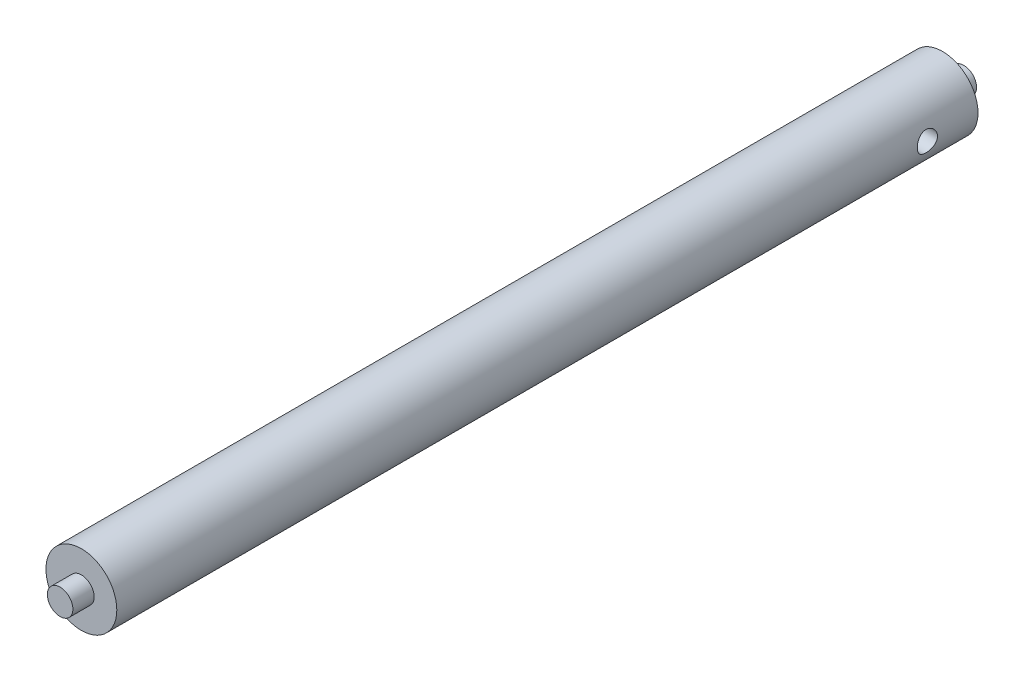
ISO-10303-21;
HEADER;
FILE_DESCRIPTION(('STEP AP214'),'2;1');
FILE_NAME('part.step','',(''),(''),'','','');
FILE_SCHEMA(('AUTOMOTIVE_DESIGN { 1 0 10303 214 1 1 1 1 }'));
ENDSEC;
DATA;
#1=APPLICATION_CONTEXT('core data for automotive mechanical design processes');
#2=APPLICATION_PROTOCOL_DEFINITION('international standard','automotive_design',2000,#1);
#3=PRODUCT_CONTEXT('',#1,'mechanical');
#4=PRODUCT('Part','Part','',(#3));
#5=PRODUCT_RELATED_PRODUCT_CATEGORY('part','',(#4));
#6=PRODUCT_DEFINITION_FORMATION('','',#4);
#7=PRODUCT_DEFINITION_CONTEXT('part definition',#1,'design');
#8=PRODUCT_DEFINITION('design','',#6,#7);
#9=PRODUCT_DEFINITION_SHAPE('','',#8);
#10=(LENGTH_UNIT() NAMED_UNIT(*) SI_UNIT(.MILLI.,.METRE.));
#11=(NAMED_UNIT(*) PLANE_ANGLE_UNIT() SI_UNIT($,.RADIAN.));
#12=(NAMED_UNIT(*) SI_UNIT($,.STERADIAN.) SOLID_ANGLE_UNIT());
#13=UNCERTAINTY_MEASURE_WITH_UNIT(LENGTH_MEASURE(1.E-05),#10,'distance_accuracy_value','');
#14=(GEOMETRIC_REPRESENTATION_CONTEXT(3) GLOBAL_UNCERTAINTY_ASSIGNED_CONTEXT((#13)) GLOBAL_UNIT_ASSIGNED_CONTEXT((#10,
#11,#12)) REPRESENTATION_CONTEXT('',''));
#15=CARTESIAN_POINT('',(0.,0.,0.));
#16=DIRECTION('',(0.,0.,1.));
#17=DIRECTION('',(1.,0.,0.));
#18=AXIS2_PLACEMENT_3D('',#15,#16,#17);
#19=CARTESIAN_POINT('',(0.,0.,1215.));
#20=DIRECTION('',(0.,0.,-1.));
#21=DIRECTION('',(-1.,0.,0.));
#22=AXIS2_PLACEMENT_3D('',#19,#20,#21);
#23=CYLINDRICAL_SURFACE('',#22,50.);
#24=CARTESIAN_POINT('',(-50.,0.,57.1));
#25=CARTESIAN_POINT('',(-49.9999993401578,0.393092581133375,57.1000010634842));
#26=CARTESIAN_POINT('',(-49.9953531545744,0.786204607705896,57.1162220404885));
#27=CARTESIAN_POINT('',(-49.9768949555591,1.5695559511447,57.1809642003));
#28=CARTESIAN_POINT('',(-49.9630823349836,1.95979507599162,57.2294875226702));
#29=CARTESIAN_POINT('',(-49.9266662796267,2.73468272530239,57.3584250289965));
#30=CARTESIAN_POINT('',(-49.9040599422796,3.11932936030579,57.4388497429035));
#31=CARTESIAN_POINT('',(-49.8506749103668,3.88016165533408,57.6308937577085));
#32=CARTESIAN_POINT('',(-49.8198963201253,4.25634742330108,57.7425126603929));
#33=CARTESIAN_POINT('',(-49.7510472300163,4.9971492546484,57.9958392093104));
#34=CARTESIAN_POINT('',(-49.7129871603524,5.36178100786337,58.1375038482982));
#35=CARTESIAN_POINT('',(-49.6305583768323,6.0776228272092,58.4499029969189));
#36=CARTESIAN_POINT('',(-49.5861896500416,6.42883286581989,58.6206375661534));
#37=CARTESIAN_POINT('',(-49.4923050586895,7.11560829245566,58.9899179438816));
#38=CARTESIAN_POINT('',(-49.4427889440032,7.45117291908063,59.1884651040247));
#39=CARTESIAN_POINT('',(-49.3398944080029,8.10458067199358,59.6119821873323));
#40=CARTESIAN_POINT('',(-49.2865157910131,8.42242289901199,59.836953449512));
#41=CARTESIAN_POINT('',(-49.1759791523237,9.04575230571379,60.3174522819858));
#42=CARTESIAN_POINT('',(-49.1187615482356,9.35076830145081,60.5735775569652));
#43=CARTESIAN_POINT('',(-49.0032674110261,9.93828125831789,61.1102540623608));
#44=CARTESIAN_POINT('',(-48.944990862325,10.2207778878036,61.3908056523778));
#45=CARTESIAN_POINT('',(-48.8289527415826,10.7614992098627,61.9745848120467));
#46=CARTESIAN_POINT('',(-48.7711912534701,11.0197200098433,62.2778160043892));
#47=CARTESIAN_POINT('',(-48.6577845038267,11.510142015897,62.9049958799905));
#48=CARTESIAN_POINT('',(-48.6021391869341,11.7423439029671,63.2289440206727));
#49=CARTESIAN_POINT('',(-48.4934364270989,12.1835671085879,63.902270234353));
#50=CARTESIAN_POINT('',(-48.4404540102544,12.3920251254503,64.2520299243441));
#51=CARTESIAN_POINT('',(-48.3399023299518,12.7786448431084,64.9686706337171));
#52=CARTESIAN_POINT('',(-48.2923331584724,12.9568060291437,65.3355519438702));
#53=CARTESIAN_POINT('',(-48.2040825925854,13.281367443723,66.0838394250183));
#54=CARTESIAN_POINT('',(-48.1634000412188,13.4277730084085,66.4652431430195));
#55=CARTESIAN_POINT('',(-48.0902058121124,13.6875982823821,67.2398879869233));
#56=CARTESIAN_POINT('',(-48.057693872318,13.8010190496043,67.6331287327258));
#57=CARTESIAN_POINT('',(-48.0026165468568,13.9913678303361,68.4182905489505));
#58=CARTESIAN_POINT('',(-47.97981719124,14.0691581174541,68.8099862202819));
#59=CARTESIAN_POINT('',(-47.9437018790497,14.1917422429174,69.5989420629842));
#60=CARTESIAN_POINT('',(-47.9303857741428,14.2365365973725,69.9962021472197));
#61=CARTESIAN_POINT('',(-47.9136670362015,14.2927035061851,70.7932110930223));
#62=CARTESIAN_POINT('',(-47.9102625268235,14.3040823863602,71.1929594691748));
#63=CARTESIAN_POINT('',(-47.9134723378561,14.2933272270579,71.9919605259831));
#64=CARTESIAN_POINT('',(-47.9200864662145,14.2711938299941,72.391213215994));
#65=CARTESIAN_POINT('',(-47.9427426868225,14.1948910789509,73.1732356971341));
#66=CARTESIAN_POINT('',(-47.9584710513845,14.1417874016875,73.5561191518278));
#67=CARTESIAN_POINT('',(-47.9986297004423,14.0048787474216,74.3158809162688));
#68=CARTESIAN_POINT('',(-48.0230597682177,13.92107453503,74.6927593753293));
#69=CARTESIAN_POINT('',(-48.079903489307,13.7234629565056,75.4379668424782));
#70=CARTESIAN_POINT('',(-48.1123176380032,13.6096537286431,75.8062953185199));
#71=CARTESIAN_POINT('',(-48.1841948692944,13.3529440492941,76.5319603430521));
#72=CARTESIAN_POINT('',(-48.2236580940452,13.2100430111174,76.8892966696983));
#73=CARTESIAN_POINT('',(-48.309063197558,12.8942425349468,77.5951502495554));
#74=CARTESIAN_POINT('',(-48.3550807358075,12.7209863906123,77.9434986960212));
#75=CARTESIAN_POINT('',(-48.4519208591473,12.3470099831757,78.6244190043368));
#76=CARTESIAN_POINT('',(-48.502743465043,12.146289601155,78.9569907978662));
#77=CARTESIAN_POINT('',(-48.6078196356526,11.7187168810827,79.6044008161063));
#78=CARTESIAN_POINT('',(-48.6620738340249,11.491859710369,79.9192357452159));
#79=CARTESIAN_POINT('',(-48.7725625617209,11.0135092144573,80.5292307478801));
#80=CARTESIAN_POINT('',(-48.8287971417993,10.7620152575553,80.8243903166186));
#81=CARTESIAN_POINT('',(-48.9439156435372,10.2259988522087,81.4040290097903));
#82=CARTESIAN_POINT('',(-49.002819359319,9.94058726465421,81.6876826617283));
#83=CARTESIAN_POINT('',(-49.1195449950259,9.34675608566722,82.23004416876));
#84=CARTESIAN_POINT('',(-49.1773668873108,9.03833590737765,82.4887513871838));
#85=CARTESIAN_POINT('',(-49.2903368902631,8.40045168905322,82.9794794032379));
#86=CARTESIAN_POINT('',(-49.3454848355772,8.07098635052609,83.2114985517281));
#87=CARTESIAN_POINT('',(-49.4515798483811,7.39316606189153,83.6471795118227));
#88=CARTESIAN_POINT('',(-49.5025269449684,7.04481124265135,83.8508415198518));
#89=CARTESIAN_POINT('',(-49.5990768394605,6.32949738342989,84.2293458588072));
#90=CARTESIAN_POINT('',(-49.6446477713202,5.96244423997879,84.4040186237585));
#91=CARTESIAN_POINT('',(-49.7288131089911,5.21410588380415,84.7217240501055));
#92=CARTESIAN_POINT('',(-49.7674074577606,4.83282055474675,84.8647564528067));
#93=CARTESIAN_POINT('',(-49.8364993996225,4.05884627033837,85.1179266577412));
#94=CARTESIAN_POINT('',(-49.8669986542504,3.66615967350749,85.2280712108579));
#95=CARTESIAN_POINT('',(-49.9190184317702,2.87224946868592,85.4145077984625));
#96=CARTESIAN_POINT('',(-49.9405392502037,2.47102614215424,85.4908009472363));
#97=CARTESIAN_POINT('',(-49.9734178080217,1.67642615652176,85.6068812725797));
#98=CARTESIAN_POINT('',(-49.9850864994534,1.28322537807025,85.6477864871573));
#99=CARTESIAN_POINT('',(-49.9991085025536,0.494624390994488,85.6969021641322));
#100=CARTESIAN_POINT('',(-50.0014620185413,0.0992242308020305,85.7051133436413));
#101=CARTESIAN_POINT('',(-49.9967881741196,-0.690797055907189,85.688767847859));
#102=CARTESIAN_POINT('',(-49.9897618391173,-1.08541826285647,85.6642147543643));
#103=CARTESIAN_POINT('',(-49.9665264525646,-1.87100372161427,85.5825701087757));
#104=CARTESIAN_POINT('',(-49.9503174564578,-2.26196799548833,85.5254787531431));
#105=CARTESIAN_POINT('',(-49.9095849111707,-3.02953083340737,85.380750156116));
#106=CARTESIAN_POINT('',(-49.8852363269616,-3.40625999169398,85.2937546915594));
#107=CARTESIAN_POINT('',(-49.828801864031,-4.15089474042818,85.0897442227331));
#108=CARTESIAN_POINT('',(-49.7967161200073,-4.5188004843619,84.9727297410688));
#109=CARTESIAN_POINT('',(-49.72564117397,-5.24339182754383,84.7095990507461));
#110=CARTESIAN_POINT('',(-49.6866514050453,-5.60007650256058,84.5634804521352));
#111=CARTESIAN_POINT('',(-49.6027735541738,-6.29992733226506,84.2432476913964));
#112=CARTESIAN_POINT('',(-49.5578853380162,-6.64309317911984,84.0691328922341));
#113=CARTESIAN_POINT('',(-49.4623270232209,-7.32106086380704,83.6900832635653));
#114=CARTESIAN_POINT('',(-49.4115527190121,-7.65552036007453,83.4845623798493));
#115=CARTESIAN_POINT('',(-49.3063726275638,-8.30603392730534,83.0470364860348));
#116=CARTESIAN_POINT('',(-49.2519667986627,-8.62208778703739,82.8150311720798));
#117=CARTESIAN_POINT('',(-49.1409346391645,-9.23391811313052,82.3260308729654));
#118=CARTESIAN_POINT('',(-49.0843078687388,-9.52969053081517,82.0690309228788));
#119=CARTESIAN_POINT('',(-48.9703249285781,-10.0990890286727,81.5317145686961));
#120=CARTESIAN_POINT('',(-48.9129687466395,-10.3727147377477,81.2513977740545));
#121=CARTESIAN_POINT('',(-48.7971671462314,-10.9047245357105,80.6596132521233));
#122=CARTESIAN_POINT('',(-48.7387477648886,-11.1623136019392,80.3474250735908));
#123=CARTESIAN_POINT('',(-48.6244078232416,-11.6503130316623,79.7020406014983));
#124=CARTESIAN_POINT('',(-48.5684873230805,-11.8807227412231,79.368843802768));
#125=CARTESIAN_POINT('',(-48.4607745832691,-12.3127130239045,78.6836204532021));
#126=CARTESIAN_POINT('',(-48.4089823035997,-12.5142938765079,78.3315940849562));
#127=CARTESIAN_POINT('',(-48.311074096453,-12.8870976202685,77.6110582359327));
#128=CARTESIAN_POINT('',(-48.2649580768278,-13.0583210042661,77.2425490228688));
#129=CARTESIAN_POINT('',(-48.1800473595999,-13.3681983821559,76.4935873090732));
#130=CARTESIAN_POINT('',(-48.1412149157389,-13.5070212584094,76.1132090133734));
#131=CARTESIAN_POINT('',(-48.0717854596705,-13.7520792177055,75.3413528607539));
#132=CARTESIAN_POINT('',(-48.0411884463039,-13.8583143053348,74.9498750053963));
#133=CARTESIAN_POINT('',(-47.9892214294507,-14.0372118429049,74.1588190690431));
#134=CARTESIAN_POINT('',(-47.9678490768455,-14.1098828404858,73.7592430774577));
#135=CARTESIAN_POINT('',(-47.935023615908,-14.2210015313549,72.9549606359918));
#136=CARTESIAN_POINT('',(-47.9235701734816,-14.2594503773332,72.5502543593784));
#137=CARTESIAN_POINT('',(-47.9112006917788,-14.3009539461153,71.7542523257614));
#138=CARTESIAN_POINT('',(-47.9099021215571,-14.3052935853248,71.3630289477578));
#139=CARTESIAN_POINT('',(-47.9168770224861,-14.2819133241611,70.5816342094238));
#140=CARTESIAN_POINT('',(-47.9251502394045,-14.2541942752857,70.1914628214277));
#141=CARTESIAN_POINT('',(-47.9510121577493,-14.1669507402721,69.4150256310124));
#142=CARTESIAN_POINT('',(-47.9686004916324,-14.1074275090193,69.0287596751105));
#143=CARTESIAN_POINT('',(-48.0125543998547,-13.9571035881562,68.262874478678));
#144=CARTESIAN_POINT('',(-48.0389200174383,-13.8663027444458,67.8832552709045));
#145=CARTESIAN_POINT('',(-48.0993237274639,-13.6552904386989,67.1371608999426));
#146=CARTESIAN_POINT('',(-48.1332800995804,-13.5353911457973,66.7705906938961));
#147=CARTESIAN_POINT('',(-48.2080385721042,-13.2666669207845,66.0489442169649));
#148=CARTESIAN_POINT('',(-48.2488405966603,-13.1178423091682,65.6938678187788));
#149=CARTESIAN_POINT('',(-48.3361556341312,-12.7923584444724,64.9973957934226));
#150=CARTESIAN_POINT('',(-48.3826693425431,-12.6156958008837,64.6560018390553));
#151=CARTESIAN_POINT('',(-48.4801413873244,-12.2357809666352,63.9889954242829));
#152=CARTESIAN_POINT('',(-48.5310999736902,-12.0325272800755,63.6633838531416));
#153=CARTESIAN_POINT('',(-48.6378682060473,-11.5935531591283,63.0192811610425));
#154=CARTESIAN_POINT('',(-48.693783087133,-11.3569743314224,62.7013922429979));
#155=CARTESIAN_POINT('',(-48.8073732087695,-10.8584374577466,62.0865151790139));
#156=CARTESIAN_POINT('',(-48.8650484865102,-10.5964788753526,61.7895274750697));
#157=CARTESIAN_POINT('',(-48.9806086089899,-10.0487963116378,61.2182363586558));
#158=CARTESIAN_POINT('',(-49.0384935023844,-9.76306642252164,60.9439386192218));
#159=CARTESIAN_POINT('',(-49.1529037826485,-9.16969616572754,60.4198653381739));
#160=CARTESIAN_POINT('',(-49.2094291938921,-8.86205619126841,60.170089356661));
#161=CARTESIAN_POINT('',(-49.3210333280281,-8.2185767845156,59.6905976431241));
#162=CARTESIAN_POINT('',(-49.3760371985178,-7.88221485997783,59.4615649883469));
#163=CARTESIAN_POINT('',(-49.4814793170541,-7.19065574824217,59.0327037610246));
#164=CARTESIAN_POINT('',(-49.5319173732886,-6.83545777072511,58.8328764151931));
#165=CARTESIAN_POINT('',(-49.6267708335611,-6.10882873481934,58.4640757885479));
#166=CARTESIAN_POINT('',(-49.6711890908296,-5.7374054779654,58.2950878773766));
#167=CARTESIAN_POINT('',(-49.7527517142921,-4.98080308482146,57.9892562715333));
#168=CARTESIAN_POINT('',(-49.7898969033813,-4.59562551057093,57.8524089400361));
#169=CARTESIAN_POINT('',(-49.8515013278377,-3.86572166480394,57.6278458000142));
#170=CARTESIAN_POINT('',(-49.8769863621289,-3.5223349638116,57.536035955306));
#171=CARTESIAN_POINT('',(-49.9210956890984,-2.8292647482291,57.3781758883436));
#172=CARTESIAN_POINT('',(-49.9397204206557,-2.47958163794534,57.3121240182403));
#173=CARTESIAN_POINT('',(-49.969688580105,-1.77600212019871,57.2062563874028));
#174=CARTESIAN_POINT('',(-49.9810329604402,-1.42210627003489,57.1664371947928));
#175=CARTESIAN_POINT('',(-49.9961892876812,-0.712145719146019,57.1133073987561));
#176=CARTESIAN_POINT('',(-50.0000005977146,-0.356080837595765,57.0999990366484));
#177=CARTESIAN_POINT('',(-50.,0.,57.1));
#178=B_SPLINE_CURVE_WITH_KNOTS('',3,(#24,#25,#26,#27,#28,#29,#30,#31,#32,#33,#34,#35,#36,#37,
#38,#39,#40,#41,#42,#43,#44,#45,#46,#47,#48,#49,#50,#51,#52,#53,#54,#55,#56,#57,#58,#59,#60,#61,
#62,#63,#64,#65,#66,#67,#68,#69,#70,#71,#72,#73,#74,#75,#76,#77,#78,#79,#80,#81,#82,#83,#84,#85,
#86,#87,#88,#89,#90,#91,#92,#93,#94,#95,#96,#97,#98,#99,#100,#101,#102,#103,#104,#105,#106,#107,
#108,#109,#110,#111,#112,#113,#114,#115,#116,#117,#118,#119,#120,#121,#122,#123,#124,#125,#126,
#127,#128,#129,#130,#131,#132,#133,#134,#135,#136,#137,#138,#139,#140,#141,#142,#143,#144,#145,
#146,#147,#148,#149,#150,#151,#152,#153,#154,#155,#156,#157,#158,#159,#160,#161,#162,#163,#164,
#165,#166,#167,#168,#169,#170,#171,#172,#173,#174,#175,#176,#177),.UNSPECIFIED.,.T.,.F.,(4,2,2,
2,2,2,2,2,2,2,2,2,2,2,2,2,2,2,2,2,2,2,2,2,2,2,2,2,2,2,2,2,2,2,2,2,2,2,2,2,2,2,2,2,2,2,2,2,2,2,2,
2,2,2,2,2,2,2,2,2,2,2,2,2,2,2,2,2,2,2,2,2,2,2,2,2,4),(0.,1.17895085298414,2.35797980217334,
3.5373982472838,4.71680163705793,5.89452809561153,7.07225696887079,8.2500430978222,
9.42788893568406,10.6336428692281,11.8394145567195,13.0453792592875,14.2513123905811,
15.4816167234651,16.7119419578329,17.9420602907395,19.1721391652332,20.3706321642395,
21.5691064164766,22.7673537732842,23.9655781605857,25.1248198180289,26.2840326059892,
27.4433173368873,28.6026254492243,29.7766029381959,30.9505855105847,32.1247855004183,
33.2990156054267,34.5176321743366,35.7362798359121,36.9550027611547,38.1737172441032,
39.3993266034378,40.6249459830965,41.8503136068423,43.0756408921959,44.2606715660697,
45.4456762473033,46.6305513942046,47.8154193870798,48.9763005959232,50.137161596195,
51.2981179626102,52.4591007495329,53.6452393661725,54.8313915927854,56.0177799194487,
57.2041881215308,58.429536245212,59.6549138446885,60.8802795638751,62.1056253879562,
63.3244340692529,64.5432425790063,65.7617405280139,66.9801974333179,68.1525233090973,
69.3248180479206,70.4970665353776,71.6693207984088,72.8295155817434,73.9896975107588,
75.1500208525047,76.3104094972369,77.509600946332,78.708817746959,79.90833347998,
81.1078276907951,82.3382419781532,83.5687079318864,84.7985886212592,86.0283300779721,
87.0963942899641,88.1643901620472,89.2322462863879,90.3001926872191),.UNSPECIFIED.);
#179=CARTESIAN_POINT('',(-50.,0.,57.1));
#180=VERTEX_POINT('',#179);
#181=EDGE_CURVE('E10',#180,#180,#178,.T.);
#182=ORIENTED_EDGE('',*,*,#181,.T.);
#183=EDGE_LOOP('',(#182));
#184=FACE_BOUND('',#183,.T.);
#185=CARTESIAN_POINT('',(50.,0.,57.1));
#186=CARTESIAN_POINT('',(49.9999993401578,-0.393092581133375,57.1000010634842));
#187=CARTESIAN_POINT('',(49.9953531545744,-0.786204607705896,57.1162220404885));
#188=CARTESIAN_POINT('',(49.9768949555591,-1.5695559511447,57.1809642003));
#189=CARTESIAN_POINT('',(49.9630823349836,-1.95979507599162,57.2294875226702));
#190=CARTESIAN_POINT('',(49.9266662796267,-2.73468272530239,57.3584250289965));
#191=CARTESIAN_POINT('',(49.9040599422796,-3.11932936030579,57.4388497429035));
#192=CARTESIAN_POINT('',(49.8506749103668,-3.88016165533408,57.6308937577085));
#193=CARTESIAN_POINT('',(49.8198963201253,-4.25634742330108,57.7425126603929));
#194=CARTESIAN_POINT('',(49.7510472300163,-4.9971492546484,57.9958392093104));
#195=CARTESIAN_POINT('',(49.7129871603524,-5.36178100786337,58.1375038482982));
#196=CARTESIAN_POINT('',(49.6305583768323,-6.0776228272092,58.4499029969189));
#197=CARTESIAN_POINT('',(49.5861896500416,-6.42883286581989,58.6206375661534));
#198=CARTESIAN_POINT('',(49.4923050586895,-7.11560829245566,58.9899179438816));
#199=CARTESIAN_POINT('',(49.4427889440032,-7.45117291908063,59.1884651040247));
#200=CARTESIAN_POINT('',(49.3398944080029,-8.10458067199358,59.6119821873323));
#201=CARTESIAN_POINT('',(49.2865157910131,-8.42242289901199,59.836953449512));
#202=CARTESIAN_POINT('',(49.1759791523237,-9.04575230571379,60.3174522819858));
#203=CARTESIAN_POINT('',(49.1187615482356,-9.35076830145081,60.5735775569652));
#204=CARTESIAN_POINT('',(49.0032674110261,-9.93828125831789,61.1102540623608));
#205=CARTESIAN_POINT('',(48.944990862325,-10.2207778878036,61.3908056523778));
#206=CARTESIAN_POINT('',(48.8289527415826,-10.7614992098627,61.9745848120467));
#207=CARTESIAN_POINT('',(48.7711912534701,-11.0197200098433,62.2778160043892));
#208=CARTESIAN_POINT('',(48.6577845038267,-11.510142015897,62.9049958799905));
#209=CARTESIAN_POINT('',(48.6021391869341,-11.7423439029671,63.2289440206727));
#210=CARTESIAN_POINT('',(48.4934364270989,-12.1835671085879,63.902270234353));
#211=CARTESIAN_POINT('',(48.4404540102544,-12.3920251254503,64.2520299243441));
#212=CARTESIAN_POINT('',(48.3399023299518,-12.7786448431084,64.9686706337171));
#213=CARTESIAN_POINT('',(48.2923331584724,-12.9568060291437,65.3355519438702));
#214=CARTESIAN_POINT('',(48.2040825925854,-13.281367443723,66.0838394250183));
#215=CARTESIAN_POINT('',(48.1634000412188,-13.4277730084085,66.4652431430195));
#216=CARTESIAN_POINT('',(48.0902058121124,-13.6875982823821,67.2398879869233));
#217=CARTESIAN_POINT('',(48.057693872318,-13.8010190496043,67.6331287327258));
#218=CARTESIAN_POINT('',(48.0026165468568,-13.9913678303361,68.4182905489505));
#219=CARTESIAN_POINT('',(47.97981719124,-14.0691581174541,68.8099862202819));
#220=CARTESIAN_POINT('',(47.9437018790497,-14.1917422429174,69.5989420629842));
#221=CARTESIAN_POINT('',(47.9303857741428,-14.2365365973725,69.9962021472197));
#222=CARTESIAN_POINT('',(47.9136670362015,-14.2927035061851,70.7932110930223));
#223=CARTESIAN_POINT('',(47.9102625268235,-14.3040823863602,71.1929594691748));
#224=CARTESIAN_POINT('',(47.9134723378561,-14.2933272270579,71.9919605259831));
#225=CARTESIAN_POINT('',(47.9200864662145,-14.2711938299941,72.391213215994));
#226=CARTESIAN_POINT('',(47.9427426868225,-14.1948910789509,73.1732356971341));
#227=CARTESIAN_POINT('',(47.9584710513845,-14.1417874016875,73.5561191518278));
#228=CARTESIAN_POINT('',(47.9986297004423,-14.0048787474216,74.3158809162688));
#229=CARTESIAN_POINT('',(48.0230597682177,-13.92107453503,74.6927593753293));
#230=CARTESIAN_POINT('',(48.079903489307,-13.7234629565056,75.4379668424782));
#231=CARTESIAN_POINT('',(48.1123176380032,-13.6096537286431,75.8062953185199));
#232=CARTESIAN_POINT('',(48.1841948692944,-13.3529440492941,76.5319603430521));
#233=CARTESIAN_POINT('',(48.2236580940452,-13.2100430111174,76.8892966696983));
#234=CARTESIAN_POINT('',(48.309063197558,-12.8942425349468,77.5951502495554));
#235=CARTESIAN_POINT('',(48.3550807358075,-12.7209863906123,77.9434986960212));
#236=CARTESIAN_POINT('',(48.4519208591473,-12.3470099831757,78.6244190043368));
#237=CARTESIAN_POINT('',(48.502743465043,-12.146289601155,78.9569907978662));
#238=CARTESIAN_POINT('',(48.6078196356526,-11.7187168810827,79.6044008161063));
#239=CARTESIAN_POINT('',(48.6620738340249,-11.491859710369,79.9192357452159));
#240=CARTESIAN_POINT('',(48.7725625617209,-11.0135092144573,80.5292307478801));
#241=CARTESIAN_POINT('',(48.8287971417993,-10.7620152575553,80.8243903166186));
#242=CARTESIAN_POINT('',(48.9439156435372,-10.2259988522087,81.4040290097903));
#243=CARTESIAN_POINT('',(49.002819359319,-9.94058726465421,81.6876826617283));
#244=CARTESIAN_POINT('',(49.1195449950259,-9.34675608566722,82.23004416876));
#245=CARTESIAN_POINT('',(49.1773668873108,-9.03833590737765,82.4887513871838));
#246=CARTESIAN_POINT('',(49.2903368902631,-8.40045168905322,82.9794794032379));
#247=CARTESIAN_POINT('',(49.3454848355772,-8.07098635052609,83.2114985517281));
#248=CARTESIAN_POINT('',(49.4515798483811,-7.39316606189153,83.6471795118227));
#249=CARTESIAN_POINT('',(49.5025269449684,-7.04481124265135,83.8508415198518));
#250=CARTESIAN_POINT('',(49.5990768394605,-6.32949738342989,84.2293458588072));
#251=CARTESIAN_POINT('',(49.6446477713202,-5.96244423997879,84.4040186237585));
#252=CARTESIAN_POINT('',(49.7288131089911,-5.21410588380415,84.7217240501055));
#253=CARTESIAN_POINT('',(49.7674074577606,-4.83282055474675,84.8647564528067));
#254=CARTESIAN_POINT('',(49.8364993996225,-4.05884627033837,85.1179266577412));
#255=CARTESIAN_POINT('',(49.8669986542504,-3.66615967350749,85.2280712108579));
#256=CARTESIAN_POINT('',(49.9190184317702,-2.87224946868592,85.4145077984625));
#257=CARTESIAN_POINT('',(49.9405392502037,-2.47102614215424,85.4908009472363));
#258=CARTESIAN_POINT('',(49.9734178080217,-1.67642615652176,85.6068812725797));
#259=CARTESIAN_POINT('',(49.9850864994534,-1.28322537807025,85.6477864871573));
#260=CARTESIAN_POINT('',(49.9991085025536,-0.494624390994488,85.6969021641322));
#261=CARTESIAN_POINT('',(50.0014620185413,-0.0992242308020305,85.7051133436413));
#262=CARTESIAN_POINT('',(49.9967881741196,0.690797055907189,85.688767847859));
#263=CARTESIAN_POINT('',(49.9897618391173,1.08541826285647,85.6642147543643));
#264=CARTESIAN_POINT('',(49.9665264525646,1.87100372161427,85.5825701087757));
#265=CARTESIAN_POINT('',(49.9503174564578,2.26196799548833,85.5254787531431));
#266=CARTESIAN_POINT('',(49.9095849111707,3.02953083340737,85.380750156116));
#267=CARTESIAN_POINT('',(49.8852363269616,3.40625999169398,85.2937546915594));
#268=CARTESIAN_POINT('',(49.828801864031,4.15089474042818,85.0897442227331));
#269=CARTESIAN_POINT('',(49.7967161200073,4.5188004843619,84.9727297410688));
#270=CARTESIAN_POINT('',(49.72564117397,5.24339182754383,84.7095990507461));
#271=CARTESIAN_POINT('',(49.6866514050453,5.60007650256058,84.5634804521352));
#272=CARTESIAN_POINT('',(49.6027735541738,6.29992733226506,84.2432476913964));
#273=CARTESIAN_POINT('',(49.5578853380162,6.64309317911984,84.0691328922341));
#274=CARTESIAN_POINT('',(49.4623270232209,7.32106086380704,83.6900832635653));
#275=CARTESIAN_POINT('',(49.4115527190121,7.65552036007453,83.4845623798493));
#276=CARTESIAN_POINT('',(49.3063726275638,8.30603392730534,83.0470364860348));
#277=CARTESIAN_POINT('',(49.2519667986627,8.62208778703739,82.8150311720798));
#278=CARTESIAN_POINT('',(49.1409346391645,9.23391811313052,82.3260308729654));
#279=CARTESIAN_POINT('',(49.0843078687388,9.52969053081517,82.0690309228788));
#280=CARTESIAN_POINT('',(48.9703249285781,10.0990890286727,81.5317145686961));
#281=CARTESIAN_POINT('',(48.9129687466395,10.3727147377477,81.2513977740545));
#282=CARTESIAN_POINT('',(48.7971671462314,10.9047245357105,80.6596132521233));
#283=CARTESIAN_POINT('',(48.7387477648886,11.1623136019392,80.3474250735908));
#284=CARTESIAN_POINT('',(48.6244078232416,11.6503130316623,79.7020406014983));
#285=CARTESIAN_POINT('',(48.5684873230805,11.8807227412231,79.368843802768));
#286=CARTESIAN_POINT('',(48.4607745832691,12.3127130239045,78.6836204532021));
#287=CARTESIAN_POINT('',(48.4089823035997,12.5142938765079,78.3315940849562));
#288=CARTESIAN_POINT('',(48.311074096453,12.8870976202685,77.6110582359327));
#289=CARTESIAN_POINT('',(48.2649580768278,13.0583210042661,77.2425490228688));
#290=CARTESIAN_POINT('',(48.1800473595999,13.3681983821559,76.4935873090732));
#291=CARTESIAN_POINT('',(48.1412149157389,13.5070212584094,76.1132090133734));
#292=CARTESIAN_POINT('',(48.0717854596705,13.7520792177055,75.3413528607539));
#293=CARTESIAN_POINT('',(48.0411884463039,13.8583143053348,74.9498750053963));
#294=CARTESIAN_POINT('',(47.9892214294507,14.0372118429049,74.1588190690431));
#295=CARTESIAN_POINT('',(47.9678490768455,14.1098828404858,73.7592430774577));
#296=CARTESIAN_POINT('',(47.935023615908,14.2210015313549,72.9549606359918));
#297=CARTESIAN_POINT('',(47.9235701734816,14.2594503773332,72.5502543593784));
#298=CARTESIAN_POINT('',(47.9112006917788,14.3009539461153,71.7542523257614));
#299=CARTESIAN_POINT('',(47.9099021215571,14.3052935853248,71.3630289477578));
#300=CARTESIAN_POINT('',(47.9168770224861,14.2819133241611,70.5816342094238));
#301=CARTESIAN_POINT('',(47.9251502394045,14.2541942752857,70.1914628214277));
#302=CARTESIAN_POINT('',(47.9510121577493,14.1669507402721,69.4150256310124));
#303=CARTESIAN_POINT('',(47.9686004916324,14.1074275090193,69.0287596751105));
#304=CARTESIAN_POINT('',(48.0125543998547,13.9571035881562,68.262874478678));
#305=CARTESIAN_POINT('',(48.0389200174383,13.8663027444458,67.8832552709045));
#306=CARTESIAN_POINT('',(48.0993237274639,13.6552904386989,67.1371608999426));
#307=CARTESIAN_POINT('',(48.1332800995804,13.5353911457973,66.7705906938961));
#308=CARTESIAN_POINT('',(48.2080385721042,13.2666669207845,66.0489442169649));
#309=CARTESIAN_POINT('',(48.2488405966603,13.1178423091682,65.6938678187788));
#310=CARTESIAN_POINT('',(48.3361556341312,12.7923584444724,64.9973957934226));
#311=CARTESIAN_POINT('',(48.3826693425431,12.6156958008837,64.6560018390553));
#312=CARTESIAN_POINT('',(48.4801413873244,12.2357809666352,63.9889954242829));
#313=CARTESIAN_POINT('',(48.5310999736902,12.0325272800755,63.6633838531416));
#314=CARTESIAN_POINT('',(48.6378682060473,11.5935531591283,63.0192811610425));
#315=CARTESIAN_POINT('',(48.693783087133,11.3569743314224,62.7013922429979));
#316=CARTESIAN_POINT('',(48.8073732087695,10.8584374577466,62.0865151790139));
#317=CARTESIAN_POINT('',(48.8650484865102,10.5964788753526,61.7895274750697));
#318=CARTESIAN_POINT('',(48.9806086089899,10.0487963116378,61.2182363586558));
#319=CARTESIAN_POINT('',(49.0384935023844,9.76306642252164,60.9439386192218));
#320=CARTESIAN_POINT('',(49.1529037826485,9.16969616572754,60.4198653381739));
#321=CARTESIAN_POINT('',(49.2094291938921,8.86205619126841,60.170089356661));
#322=CARTESIAN_POINT('',(49.3210333280281,8.2185767845156,59.6905976431241));
#323=CARTESIAN_POINT('',(49.3760371985178,7.88221485997783,59.4615649883469));
#324=CARTESIAN_POINT('',(49.4814793170541,7.19065574824217,59.0327037610246));
#325=CARTESIAN_POINT('',(49.5319173732886,6.83545777072511,58.8328764151931));
#326=CARTESIAN_POINT('',(49.6267708335611,6.10882873481934,58.4640757885479));
#327=CARTESIAN_POINT('',(49.6711890908296,5.7374054779654,58.2950878773766));
#328=CARTESIAN_POINT('',(49.7527517142921,4.98080308482146,57.9892562715333));
#329=CARTESIAN_POINT('',(49.7898969033813,4.59562551057093,57.8524089400361));
#330=CARTESIAN_POINT('',(49.8515013278377,3.86572166480394,57.6278458000142));
#331=CARTESIAN_POINT('',(49.8769863621289,3.5223349638116,57.536035955306));
#332=CARTESIAN_POINT('',(49.9210956890984,2.8292647482291,57.3781758883436));
#333=CARTESIAN_POINT('',(49.9397204206557,2.47958163794534,57.3121240182403));
#334=CARTESIAN_POINT('',(49.969688580105,1.77600212019871,57.2062563874028));
#335=CARTESIAN_POINT('',(49.9810329604402,1.42210627003489,57.1664371947928));
#336=CARTESIAN_POINT('',(49.9961892876812,0.712145719146019,57.1133073987561));
#337=CARTESIAN_POINT('',(50.0000005977146,0.356080837595765,57.0999990366484));
#338=CARTESIAN_POINT('',(50.,0.,57.1));
#339=B_SPLINE_CURVE_WITH_KNOTS('',3,(#185,#186,#187,#188,#189,#190,#191,#192,#193,#194,#195,
#196,#197,#198,#199,#200,#201,#202,#203,#204,#205,#206,#207,#208,#209,#210,#211,#212,#213,#214,
#215,#216,#217,#218,#219,#220,#221,#222,#223,#224,#225,#226,#227,#228,#229,#230,#231,#232,#233,
#234,#235,#236,#237,#238,#239,#240,#241,#242,#243,#244,#245,#246,#247,#248,#249,#250,#251,#252,
#253,#254,#255,#256,#257,#258,#259,#260,#261,#262,#263,#264,#265,#266,#267,#268,#269,#270,#271,
#272,#273,#274,#275,#276,#277,#278,#279,#280,#281,#282,#283,#284,#285,#286,#287,#288,#289,#290,
#291,#292,#293,#294,#295,#296,#297,#298,#299,#300,#301,#302,#303,#304,#305,#306,#307,#308,#309,
#310,#311,#312,#313,#314,#315,#316,#317,#318,#319,#320,#321,#322,#323,#324,#325,#326,#327,#328,
#329,#330,#331,#332,#333,#334,#335,#336,#337,#338),.UNSPECIFIED.,.T.,.F.,(4,2,2,2,2,2,2,2,2,2,2,
2,2,2,2,2,2,2,2,2,2,2,2,2,2,2,2,2,2,2,2,2,2,2,2,2,2,2,2,2,2,2,2,2,2,2,2,2,2,2,2,2,2,2,2,2,2,2,2,
2,2,2,2,2,2,2,2,2,2,2,2,2,2,2,2,2,4),(0.,1.17895085298414,2.35797980217334,3.5373982472838,
4.71680163705793,5.89452809561153,7.07225696887079,8.2500430978222,9.42788893568406,
10.6336428692281,11.8394145567195,13.0453792592875,14.2513123905811,15.4816167234651,
16.7119419578329,17.9420602907395,19.1721391652332,20.3706321642395,21.5691064164766,
22.7673537732842,23.9655781605857,25.1248198180289,26.2840326059892,27.4433173368873,
28.6026254492243,29.7766029381959,30.9505855105847,32.1247855004183,33.2990156054267,
34.5176321743366,35.7362798359121,36.9550027611547,38.1737172441032,39.3993266034378,
40.6249459830965,41.8503136068423,43.0756408921959,44.2606715660697,45.4456762473033,
46.6305513942046,47.8154193870798,48.9763005959232,50.137161596195,51.2981179626102,
52.4591007495329,53.6452393661725,54.8313915927854,56.0177799194487,57.2041881215308,
58.429536245212,59.6549138446885,60.8802795638751,62.1056253879562,63.3244340692529,
64.5432425790063,65.7617405280139,66.9801974333179,68.1525233090973,69.3248180479206,
70.4970665353776,71.6693207984088,72.8295155817434,73.9896975107588,75.1500208525047,
76.3104094972369,77.509600946332,78.708817746959,79.90833347998,81.1078276907951,
82.3382419781532,83.5687079318864,84.7985886212592,86.0283300779721,87.0963942899641,
88.1643901620472,89.2322462863879,90.3001926872191),.UNSPECIFIED.);
#340=CARTESIAN_POINT('',(50.,0.,57.1));
#341=VERTEX_POINT('',#340);
#342=EDGE_CURVE('E47',#341,#341,#339,.T.);
#343=ORIENTED_EDGE('',*,*,#342,.T.);
#344=EDGE_LOOP('',(#343));
#345=FACE_BOUND('',#344,.T.);
#346=CARTESIAN_POINT('',(0.,0.,1215.));
#347=DIRECTION('',(0.,0.,1.));
#348=DIRECTION('',(1.,0.,0.));
#349=AXIS2_PLACEMENT_3D('',#346,#347,#348);
#350=CIRCLE('',#349,50.);
#351=CARTESIAN_POINT('',(50.,0.,1215.));
#352=VERTEX_POINT('',#351);
#353=EDGE_CURVE('E104',#352,#352,#350,.T.);
#354=ORIENTED_EDGE('',*,*,#353,.F.);
#355=EDGE_LOOP('',(#354));
#356=FACE_BOUND('',#355,.T.);
#357=CARTESIAN_POINT('',(0.,0.,0.));
#358=DIRECTION('',(0.,0.,1.));
#359=DIRECTION('',(1.,0.,0.));
#360=AXIS2_PLACEMENT_3D('',#357,#358,#359);
#361=CIRCLE('',#360,50.);
#362=CARTESIAN_POINT('',(50.,0.,0.));
#363=VERTEX_POINT('',#362);
#364=EDGE_CURVE('E61',#363,#363,#361,.T.);
#365=ORIENTED_EDGE('',*,*,#364,.T.);
#366=EDGE_LOOP('',(#365));
#367=FACE_BOUND('',#366,.T.);
#368=ADVANCED_FACE('F36',(#184,#345,#356,#367),#23,.T.);
#369=CARTESIAN_POINT('',(0.,0.,1215.));
#370=DIRECTION('',(0.,0.,1.));
#371=DIRECTION('',(1.,0.,0.));
#372=AXIS2_PLACEMENT_3D('',#369,#370,#371);
#373=PLANE('',#372);
#374=CARTESIAN_POINT('',(0.,0.,1215.));
#375=DIRECTION('',(0.,0.,1.));
#376=DIRECTION('',(1.,0.,0.));
#377=AXIS2_PLACEMENT_3D('',#374,#375,#376);
#378=CIRCLE('',#377,18.);
#379=CARTESIAN_POINT('',(18.,0.,1215.));
#380=VERTEX_POINT('',#379);
#381=EDGE_CURVE('E51',#380,#380,#378,.T.);
#382=ORIENTED_EDGE('',*,*,#381,.F.);
#383=EDGE_LOOP('',(#382));
#384=FACE_BOUND('',#383,.T.);
#385=ORIENTED_EDGE('',*,*,#353,.T.);
#386=EDGE_LOOP('',(#385));
#387=FACE_BOUND('',#386,.T.);
#388=ADVANCED_FACE('F86',(#384,#387),#373,.T.);
#389=CARTESIAN_POINT('',(0.,0.,0.));
#390=DIRECTION('',(0.,0.,1.));
#391=DIRECTION('',(1.,0.,0.));
#392=AXIS2_PLACEMENT_3D('',#389,#390,#391);
#393=PLANE('',#392);
#394=CARTESIAN_POINT('',(0.,0.,0.));
#395=DIRECTION('',(0.,0.,-1.));
#396=DIRECTION('',(-1.,0.,0.));
#397=AXIS2_PLACEMENT_3D('',#394,#395,#396);
#398=CIRCLE('',#397,18.);
#399=CARTESIAN_POINT('',(-18.,0.,0.));
#400=VERTEX_POINT('',#399);
#401=EDGE_CURVE('E55',#400,#400,#398,.T.);
#402=ORIENTED_EDGE('',*,*,#401,.F.);
#403=EDGE_LOOP('',(#402));
#404=FACE_BOUND('',#403,.T.);
#405=ORIENTED_EDGE('',*,*,#364,.F.);
#406=EDGE_LOOP('',(#405));
#407=FACE_BOUND('',#406,.T.);
#408=ADVANCED_FACE('F84',(#404,#407),#393,.F.);
#409=CARTESIAN_POINT('',(0.,0.,-30.));
#410=DIRECTION('',(0.,0.,1.));
#411=DIRECTION('',(1.,0.,0.));
#412=AXIS2_PLACEMENT_3D('',#409,#410,#411);
#413=CYLINDRICAL_SURFACE('',#412,18.);
#414=CARTESIAN_POINT('',(0.,0.,-30.));
#415=DIRECTION('',(0.,0.,-1.));
#416=DIRECTION('',(-1.,0.,0.));
#417=AXIS2_PLACEMENT_3D('',#414,#415,#416);
#418=CIRCLE('',#417,18.);
#419=CARTESIAN_POINT('',(-18.,0.,-30.));
#420=VERTEX_POINT('',#419);
#421=EDGE_CURVE('E107',#420,#420,#418,.T.);
#422=ORIENTED_EDGE('',*,*,#421,.F.);
#423=EDGE_LOOP('',(#422));
#424=FACE_BOUND('',#423,.T.);
#425=ORIENTED_EDGE('',*,*,#401,.T.);
#426=EDGE_LOOP('',(#425));
#427=FACE_BOUND('',#426,.T.);
#428=ADVANCED_FACE('F80',(#424,#427),#413,.T.);
#429=CARTESIAN_POINT('',(0.,0.,-30.));
#430=DIRECTION('',(0.,0.,-1.));
#431=DIRECTION('',(-1.,0.,0.));
#432=AXIS2_PLACEMENT_3D('',#429,#430,#431);
#433=PLANE('',#432);
#434=ORIENTED_EDGE('',*,*,#421,.T.);
#435=EDGE_LOOP('',(#434));
#436=FACE_BOUND('',#435,.T.);
#437=ADVANCED_FACE('F76',(#436),#433,.T.);
#438=CARTESIAN_POINT('',(0.,0.,1245.));
#439=DIRECTION('',(0.,0.,-1.));
#440=DIRECTION('',(-1.,0.,0.));
#441=AXIS2_PLACEMENT_3D('',#438,#439,#440);
#442=CYLINDRICAL_SURFACE('',#441,18.);
#443=CARTESIAN_POINT('',(0.,0.,1245.));
#444=DIRECTION('',(0.,0.,1.));
#445=DIRECTION('',(1.,0.,0.));
#446=AXIS2_PLACEMENT_3D('',#443,#444,#445);
#447=CIRCLE('',#446,18.);
#448=CARTESIAN_POINT('',(18.,0.,1245.));
#449=VERTEX_POINT('',#448);
#450=EDGE_CURVE('E109',#449,#449,#447,.T.);
#451=ORIENTED_EDGE('',*,*,#450,.F.);
#452=EDGE_LOOP('',(#451));
#453=FACE_BOUND('',#452,.T.);
#454=ORIENTED_EDGE('',*,*,#381,.T.);
#455=EDGE_LOOP('',(#454));
#456=FACE_BOUND('',#455,.T.);
#457=ADVANCED_FACE('F72',(#453,#456),#442,.T.);
#458=CARTESIAN_POINT('',(0.,0.,1245.));
#459=DIRECTION('',(0.,0.,1.));
#460=DIRECTION('',(1.,0.,0.));
#461=AXIS2_PLACEMENT_3D('',#458,#459,#460);
#462=PLANE('',#461);
#463=ORIENTED_EDGE('',*,*,#450,.T.);
#464=EDGE_LOOP('',(#463));
#465=FACE_BOUND('',#464,.T.);
#466=ADVANCED_FACE('F67',(#465),#462,.T.);
#467=CARTESIAN_POINT('',(-50.,0.,71.4));
#468=DIRECTION('',(1.,0.,0.));
#469=DIRECTION('',(0.,0.,-1.));
#470=AXIS2_PLACEMENT_3D('',#467,#468,#469);
#471=CYLINDRICAL_SURFACE('',#470,14.3);
#472=ORIENTED_EDGE('',*,*,#342,.F.);
#473=EDGE_LOOP('',(#472));
#474=FACE_BOUND('',#473,.T.);
#475=ORIENTED_EDGE('',*,*,#181,.F.);
#476=EDGE_LOOP('',(#475));
#477=FACE_BOUND('',#476,.T.);
#478=ADVANCED_FACE('F63',(#474,#477),#471,.F.);
#479=CLOSED_SHELL('',(#368,#388,#408,#428,#437,#457,#466,#478));
#480=MANIFOLD_SOLID_BREP('B2',#479);
#481=ADVANCED_BREP_SHAPE_REPRESENTATION('',(#18,#480),#14);
#482=SHAPE_DEFINITION_REPRESENTATION(#9,#481);
ENDSEC;
END-ISO-10303-21;
